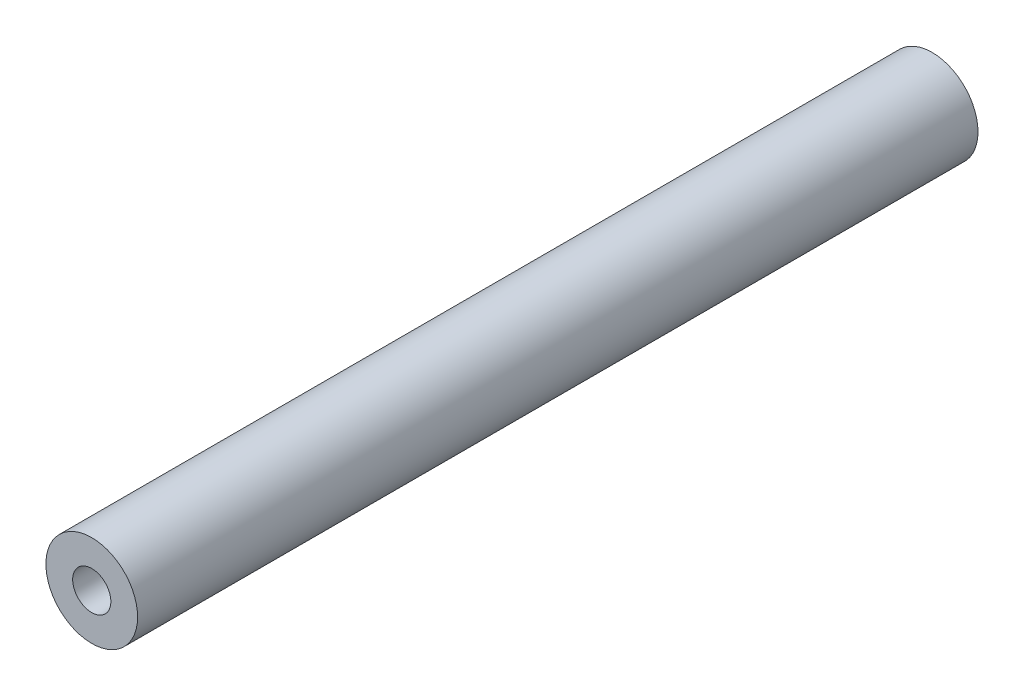
ISO-10303-21;
HEADER;
FILE_DESCRIPTION(('STEP AP214'),'2;1');
FILE_NAME('part.step','',(''),(''),'','','');
FILE_SCHEMA(('AUTOMOTIVE_DESIGN { 1 0 10303 214 1 1 1 1 }'));
ENDSEC;
DATA;
#1=APPLICATION_CONTEXT('core data for automotive mechanical design processes');
#2=APPLICATION_PROTOCOL_DEFINITION('international standard','automotive_design',2000,#1);
#3=PRODUCT_CONTEXT('',#1,'mechanical');
#4=PRODUCT('Part','Part','',(#3));
#5=PRODUCT_RELATED_PRODUCT_CATEGORY('part','',(#4));
#6=PRODUCT_DEFINITION_FORMATION('','',#4);
#7=PRODUCT_DEFINITION_CONTEXT('part definition',#1,'design');
#8=PRODUCT_DEFINITION('design','',#6,#7);
#9=PRODUCT_DEFINITION_SHAPE('','',#8);
#10=(LENGTH_UNIT() NAMED_UNIT(*) SI_UNIT(.MILLI.,.METRE.));
#11=(NAMED_UNIT(*) PLANE_ANGLE_UNIT() SI_UNIT($,.RADIAN.));
#12=(NAMED_UNIT(*) SI_UNIT($,.STERADIAN.) SOLID_ANGLE_UNIT());
#13=UNCERTAINTY_MEASURE_WITH_UNIT(LENGTH_MEASURE(1.E-05),#10,'distance_accuracy_value','');
#14=(GEOMETRIC_REPRESENTATION_CONTEXT(3) GLOBAL_UNCERTAINTY_ASSIGNED_CONTEXT((#13)) GLOBAL_UNIT_ASSIGNED_CONTEXT((#10,
#11,#12)) REPRESENTATION_CONTEXT('',''));
#15=CARTESIAN_POINT('',(0.,0.,0.));
#16=DIRECTION('',(0.,0.,1.));
#17=DIRECTION('',(1.,0.,0.));
#18=AXIS2_PLACEMENT_3D('',#15,#16,#17);
#19=CARTESIAN_POINT('',(0.,0.,55.));
#20=DIRECTION('',(0.,0.,-1.));
#21=DIRECTION('',(-1.,0.,0.));
#22=AXIS2_PLACEMENT_3D('',#19,#20,#21);
#23=CYLINDRICAL_SURFACE('',#22,3.);
#24=CARTESIAN_POINT('',(0.,0.,55.));
#25=DIRECTION('',(0.,0.,1.));
#26=DIRECTION('',(1.,0.,0.));
#27=AXIS2_PLACEMENT_3D('',#24,#25,#26);
#28=CIRCLE('',#27,3.);
#29=CARTESIAN_POINT('',(3.,0.,55.));
#30=VERTEX_POINT('',#29);
#31=EDGE_CURVE('E11',#30,#30,#28,.T.);
#32=ORIENTED_EDGE('',*,*,#31,.F.);
#33=EDGE_LOOP('',(#32));
#34=FACE_BOUND('',#33,.T.);
#35=CARTESIAN_POINT('',(0.,0.,0.));
#36=DIRECTION('',(0.,0.,1.));
#37=DIRECTION('',(1.,0.,0.));
#38=AXIS2_PLACEMENT_3D('',#35,#36,#37);
#39=CIRCLE('',#38,3.);
#40=CARTESIAN_POINT('',(3.,0.,0.));
#41=VERTEX_POINT('',#40);
#42=EDGE_CURVE('E36',#41,#41,#39,.T.);
#43=ORIENTED_EDGE('',*,*,#42,.T.);
#44=EDGE_LOOP('',(#43));
#45=FACE_BOUND('',#44,.T.);
#46=ADVANCED_FACE('F33',(#34,#45),#23,.T.);
#47=CARTESIAN_POINT('',(0.,0.,55.));
#48=DIRECTION('',(0.,0.,1.));
#49=DIRECTION('',(1.,0.,0.));
#50=AXIS2_PLACEMENT_3D('',#47,#48,#49);
#51=PLANE('',#50);
#52=CARTESIAN_POINT('',(0.,0.,55.));
#53=DIRECTION('',(0.,0.,1.));
#54=DIRECTION('',(1.,0.,0.));
#55=AXIS2_PLACEMENT_3D('',#52,#53,#54);
#56=CIRCLE('',#55,1.25);
#57=CARTESIAN_POINT('',(1.25,0.,55.));
#58=VERTEX_POINT('',#57);
#59=EDGE_CURVE('E56',#58,#58,#56,.T.);
#60=ORIENTED_EDGE('',*,*,#59,.F.);
#61=EDGE_LOOP('',(#60));
#62=FACE_BOUND('',#61,.T.);
#63=ORIENTED_EDGE('',*,*,#31,.T.);
#64=EDGE_LOOP('',(#63));
#65=FACE_BOUND('',#64,.T.);
#66=ADVANCED_FACE('F75',(#62,#65),#51,.T.);
#67=CARTESIAN_POINT('',(0.,0.,0.));
#68=DIRECTION('',(0.,0.,1.));
#69=DIRECTION('',(1.,0.,0.));
#70=AXIS2_PLACEMENT_3D('',#67,#68,#69);
#71=PLANE('',#70);
#72=CARTESIAN_POINT('',(0.,0.,0.));
#73=DIRECTION('',(0.,0.,-1.));
#74=DIRECTION('',(-1.,0.,0.));
#75=AXIS2_PLACEMENT_3D('',#72,#73,#74);
#76=CIRCLE('',#75,1.25);
#77=CARTESIAN_POINT('',(-1.25,0.,0.));
#78=VERTEX_POINT('',#77);
#79=EDGE_CURVE('E57',#78,#78,#76,.T.);
#80=ORIENTED_EDGE('',*,*,#79,.F.);
#81=EDGE_LOOP('',(#80));
#82=FACE_BOUND('',#81,.T.);
#83=ORIENTED_EDGE('',*,*,#42,.F.);
#84=EDGE_LOOP('',(#83));
#85=FACE_BOUND('',#84,.T.);
#86=ADVANCED_FACE('F72',(#82,#85),#71,.F.);
#87=CARTESIAN_POINT('',(0.,0.,51.));
#88=DIRECTION('',(0.,0.,1.));
#89=DIRECTION('',(1.,0.,0.));
#90=AXIS2_PLACEMENT_3D('',#87,#88,#89);
#91=CONICAL_SURFACE('',#90,1.25,1.02974425867665);
#92=CARTESIAN_POINT('',(0.,0.,50.2489242262155));
#93=VERTEX_POINT('',#92);
#94=VERTEX_LOOP('',#93);
#95=FACE_BOUND('',#94,.T.);
#96=CARTESIAN_POINT('',(0.,0.,51.));
#97=DIRECTION('',(0.,0.,1.));
#98=DIRECTION('',(1.,0.,0.));
#99=AXIS2_PLACEMENT_3D('',#96,#97,#98);
#100=CIRCLE('',#99,1.25);
#101=CARTESIAN_POINT('',(1.25,0.,51.));
#102=VERTEX_POINT('',#101);
#103=EDGE_CURVE('E60',#102,#102,#100,.T.);
#104=ORIENTED_EDGE('',*,*,#103,.T.);
#105=EDGE_LOOP('',(#104));
#106=FACE_BOUND('',#105,.T.);
#107=ADVANCED_FACE('F74',(#95,#106),#91,.F.);
#108=CARTESIAN_POINT('',(0.,0.,55.));
#109=DIRECTION('',(0.,0.,1.));
#110=DIRECTION('',(1.,0.,0.));
#111=AXIS2_PLACEMENT_3D('',#108,#109,#110);
#112=CYLINDRICAL_SURFACE('',#111,1.25);
#113=ORIENTED_EDGE('',*,*,#103,.F.);
#114=EDGE_LOOP('',(#113));
#115=FACE_BOUND('',#114,.T.);
#116=ORIENTED_EDGE('',*,*,#59,.T.);
#117=EDGE_LOOP('',(#116));
#118=FACE_BOUND('',#117,.T.);
#119=ADVANCED_FACE('F50',(#115,#118),#112,.F.);
#120=CARTESIAN_POINT('',(0.,0.,4.));
#121=DIRECTION('',(0.,0.,-1.));
#122=DIRECTION('',(-1.,0.,0.));
#123=AXIS2_PLACEMENT_3D('',#120,#121,#122);
#124=CONICAL_SURFACE('',#123,1.25,1.02974425867665);
#125=CARTESIAN_POINT('',(0.,0.,4.75107577378445));
#126=VERTEX_POINT('',#125);
#127=VERTEX_LOOP('',#126);
#128=FACE_BOUND('',#127,.T.);
#129=CARTESIAN_POINT('',(0.,0.,4.));
#130=DIRECTION('',(0.,0.,-1.));
#131=DIRECTION('',(-1.,0.,0.));
#132=AXIS2_PLACEMENT_3D('',#129,#130,#131);
#133=CIRCLE('',#132,1.25);
#134=CARTESIAN_POINT('',(-1.25,0.,4.));
#135=VERTEX_POINT('',#134);
#136=EDGE_CURVE('E54',#135,#135,#133,.T.);
#137=ORIENTED_EDGE('',*,*,#136,.T.);
#138=EDGE_LOOP('',(#137));
#139=FACE_BOUND('',#138,.T.);
#140=ADVANCED_FACE('F46',(#128,#139),#124,.F.);
#141=CARTESIAN_POINT('',(0.,0.,0.));
#142=DIRECTION('',(0.,0.,-1.));
#143=DIRECTION('',(-1.,0.,0.));
#144=AXIS2_PLACEMENT_3D('',#141,#142,#143);
#145=CYLINDRICAL_SURFACE('',#144,1.25);
#146=ORIENTED_EDGE('',*,*,#136,.F.);
#147=EDGE_LOOP('',(#146));
#148=FACE_BOUND('',#147,.T.);
#149=ORIENTED_EDGE('',*,*,#79,.T.);
#150=EDGE_LOOP('',(#149));
#151=FACE_BOUND('',#150,.T.);
#152=ADVANCED_FACE('F49',(#148,#151),#145,.F.);
#153=CLOSED_SHELL('',(#46,#66,#86,#107,#119,#140,#152));
#154=MANIFOLD_SOLID_BREP('B2',#153);
#155=ADVANCED_BREP_SHAPE_REPRESENTATION('',(#18,#154),#14);
#156=SHAPE_DEFINITION_REPRESENTATION(#9,#155);
ENDSEC;
END-ISO-10303-21;
